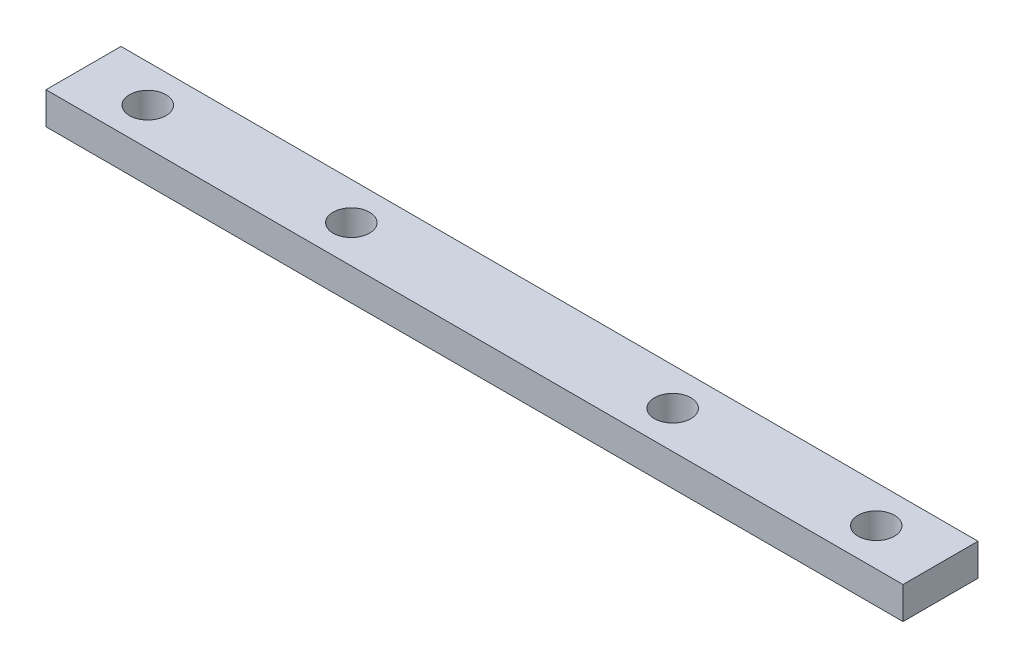
ISO-10303-21;
HEADER;
FILE_DESCRIPTION(('STEP AP214'),'2;1');
FILE_NAME('part.step','',(''),(''),'','','');
FILE_SCHEMA(('AUTOMOTIVE_DESIGN { 1 0 10303 214 1 1 1 1 }'));
ENDSEC;
DATA;
#1=APPLICATION_CONTEXT('core data for automotive mechanical design processes');
#2=APPLICATION_PROTOCOL_DEFINITION('international standard','automotive_design',2000,#1);
#3=PRODUCT_CONTEXT('',#1,'mechanical');
#4=PRODUCT('Part','Part','',(#3));
#5=PRODUCT_RELATED_PRODUCT_CATEGORY('part','',(#4));
#6=PRODUCT_DEFINITION_FORMATION('','',#4);
#7=PRODUCT_DEFINITION_CONTEXT('part definition',#1,'design');
#8=PRODUCT_DEFINITION('design','',#6,#7);
#9=PRODUCT_DEFINITION_SHAPE('','',#8);
#10=(LENGTH_UNIT() NAMED_UNIT(*) SI_UNIT(.MILLI.,.METRE.));
#11=(NAMED_UNIT(*) PLANE_ANGLE_UNIT() SI_UNIT($,.RADIAN.));
#12=(NAMED_UNIT(*) SI_UNIT($,.STERADIAN.) SOLID_ANGLE_UNIT());
#13=UNCERTAINTY_MEASURE_WITH_UNIT(LENGTH_MEASURE(1.E-05),#10,'distance_accuracy_value','');
#14=(GEOMETRIC_REPRESENTATION_CONTEXT(3) GLOBAL_UNCERTAINTY_ASSIGNED_CONTEXT((#13)) GLOBAL_UNIT_ASSIGNED_CONTEXT((#10,
#11,#12)) REPRESENTATION_CONTEXT('',''));
#15=CARTESIAN_POINT('',(0.,0.,0.));
#16=DIRECTION('',(0.,0.,1.));
#17=DIRECTION('',(1.,0.,0.));
#18=AXIS2_PLACEMENT_3D('',#15,#16,#17);
#19=CARTESIAN_POINT('',(40.,3.,3.5));
#20=DIRECTION('',(-1.,0.,0.));
#21=DIRECTION('',(0.,0.,1.));
#22=AXIS2_PLACEMENT_3D('',#19,#20,#21);
#23=PLANE('',#22);
#24=DIRECTION('',(0.,0.,-1.));
#25=VECTOR('',#24,1.);
#26=CARTESIAN_POINT('',(40.,0.,3.5));
#27=LINE('',#26,#25);
#28=CARTESIAN_POINT('',(40.,0.,3.5));
#29=VERTEX_POINT('',#28);
#30=CARTESIAN_POINT('',(40.,0.,-3.5));
#31=VERTEX_POINT('',#30);
#32=EDGE_CURVE('E96',#29,#31,#27,.T.);
#33=ORIENTED_EDGE('',*,*,#32,.T.);
#34=DIRECTION('',(0.,-1.,0.));
#35=VECTOR('',#34,1.);
#36=CARTESIAN_POINT('',(40.,3.,-3.5));
#37=LINE('',#36,#35);
#38=CARTESIAN_POINT('',(40.,3.,-3.5));
#39=VERTEX_POINT('',#38);
#40=EDGE_CURVE('E11',#39,#31,#37,.T.);
#41=ORIENTED_EDGE('',*,*,#40,.F.);
#42=DIRECTION('',(0.,0.,-1.));
#43=VECTOR('',#42,1.);
#44=CARTESIAN_POINT('',(40.,3.,3.5));
#45=LINE('',#44,#43);
#46=CARTESIAN_POINT('',(40.,3.,3.5));
#47=VERTEX_POINT('',#46);
#48=EDGE_CURVE('E84',#47,#39,#45,.T.);
#49=ORIENTED_EDGE('',*,*,#48,.F.);
#50=DIRECTION('',(0.,-1.,0.));
#51=VECTOR('',#50,1.);
#52=CARTESIAN_POINT('',(40.,3.,3.5));
#53=LINE('',#52,#51);
#54=EDGE_CURVE('E92',#47,#29,#53,.T.);
#55=ORIENTED_EDGE('',*,*,#54,.T.);
#56=EDGE_LOOP('',(#33,#41,#49,#55));
#57=FACE_BOUND('',#56,.T.);
#58=ADVANCED_FACE('F33',(#57),#23,.F.);
#59=CARTESIAN_POINT('',(-40.,3.,-3.5));
#60=DIRECTION('',(0.,0.,1.));
#61=DIRECTION('',(1.,0.,0.));
#62=AXIS2_PLACEMENT_3D('',#59,#60,#61);
#63=PLANE('',#62);
#64=DIRECTION('',(-1.,0.,0.));
#65=VECTOR('',#64,1.);
#66=CARTESIAN_POINT('',(-40.,0.,-3.5));
#67=LINE('',#66,#65);
#68=CARTESIAN_POINT('',(-40.,0.,-3.5));
#69=VERTEX_POINT('',#68);
#70=EDGE_CURVE('E88',#31,#69,#67,.T.);
#71=ORIENTED_EDGE('',*,*,#70,.T.);
#72=DIRECTION('',(0.,-1.,0.));
#73=VECTOR('',#72,1.);
#74=CARTESIAN_POINT('',(-40.,3.,-3.5));
#75=LINE('',#74,#73);
#76=CARTESIAN_POINT('',(-40.,3.,-3.5));
#77=VERTEX_POINT('',#76);
#78=EDGE_CURVE('E41',#77,#69,#75,.T.);
#79=ORIENTED_EDGE('',*,*,#78,.F.);
#80=DIRECTION('',(-1.,0.,0.));
#81=VECTOR('',#80,1.);
#82=CARTESIAN_POINT('',(-40.,3.,-3.5));
#83=LINE('',#82,#81);
#84=EDGE_CURVE('E79',#39,#77,#83,.T.);
#85=ORIENTED_EDGE('',*,*,#84,.F.);
#86=ORIENTED_EDGE('',*,*,#40,.T.);
#87=EDGE_LOOP('',(#71,#79,#85,#86));
#88=FACE_BOUND('',#87,.T.);
#89=ADVANCED_FACE('F87',(#88),#63,.F.);
#90=CARTESIAN_POINT('',(-40.,3.,3.5));
#91=DIRECTION('',(1.,0.,0.));
#92=DIRECTION('',(0.,0.,-1.));
#93=AXIS2_PLACEMENT_3D('',#90,#91,#92);
#94=PLANE('',#93);
#95=DIRECTION('',(0.,0.,1.));
#96=VECTOR('',#95,1.);
#97=CARTESIAN_POINT('',(-40.,0.,3.5));
#98=LINE('',#97,#96);
#99=CARTESIAN_POINT('',(-40.,0.,3.5));
#100=VERTEX_POINT('',#99);
#101=EDGE_CURVE('E66',#69,#100,#98,.T.);
#102=ORIENTED_EDGE('',*,*,#101,.T.);
#103=DIRECTION('',(0.,-1.,0.));
#104=VECTOR('',#103,1.);
#105=CARTESIAN_POINT('',(-40.,3.,3.5));
#106=LINE('',#105,#104);
#107=CARTESIAN_POINT('',(-40.,3.,3.5));
#108=VERTEX_POINT('',#107);
#109=EDGE_CURVE('E89',#108,#100,#106,.T.);
#110=ORIENTED_EDGE('',*,*,#109,.F.);
#111=DIRECTION('',(0.,0.,1.));
#112=VECTOR('',#111,1.);
#113=CARTESIAN_POINT('',(-40.,3.,3.5));
#114=LINE('',#113,#112);
#115=EDGE_CURVE('E82',#77,#108,#114,.T.);
#116=ORIENTED_EDGE('',*,*,#115,.F.);
#117=ORIENTED_EDGE('',*,*,#78,.T.);
#118=EDGE_LOOP('',(#102,#110,#116,#117));
#119=FACE_BOUND('',#118,.T.);
#120=ADVANCED_FACE('F90',(#119),#94,.F.);
#121=CARTESIAN_POINT('',(-40.,3.,3.5));
#122=DIRECTION('',(0.,0.,-1.));
#123=DIRECTION('',(-1.,0.,0.));
#124=AXIS2_PLACEMENT_3D('',#121,#122,#123);
#125=PLANE('',#124);
#126=DIRECTION('',(1.,0.,0.));
#127=VECTOR('',#126,1.);
#128=CARTESIAN_POINT('',(-40.,0.,3.5));
#129=LINE('',#128,#127);
#130=EDGE_CURVE('E72',#100,#29,#129,.T.);
#131=ORIENTED_EDGE('',*,*,#130,.T.);
#132=ORIENTED_EDGE('',*,*,#54,.F.);
#133=DIRECTION('',(1.,0.,0.));
#134=VECTOR('',#133,1.);
#135=CARTESIAN_POINT('',(-40.,3.,3.5));
#136=LINE('',#135,#134);
#137=EDGE_CURVE('E49',#108,#47,#136,.T.);
#138=ORIENTED_EDGE('',*,*,#137,.F.);
#139=ORIENTED_EDGE('',*,*,#109,.T.);
#140=EDGE_LOOP('',(#131,#132,#138,#139));
#141=FACE_BOUND('',#140,.T.);
#142=ADVANCED_FACE('F104',(#141),#125,.F.);
#143=CARTESIAN_POINT('',(0.,3.,0.));
#144=DIRECTION('',(0.,-1.,0.));
#145=DIRECTION('',(0.,0.,-1.));
#146=AXIS2_PLACEMENT_3D('',#143,#144,#145);
#147=PLANE('',#146);
#148=CARTESIAN_POINT('',(-15.,3.,0.));
#149=DIRECTION('',(0.,1.,0.));
#150=DIRECTION('',(0.,0.,1.));
#151=AXIS2_PLACEMENT_3D('',#148,#149,#150);
#152=CIRCLE('',#151,1.7);
#153=CARTESIAN_POINT('',(-15.,3.,1.7));
#154=VERTEX_POINT('',#153);
#155=EDGE_CURVE('E128',#154,#154,#152,.T.);
#156=ORIENTED_EDGE('',*,*,#155,.F.);
#157=EDGE_LOOP('',(#156));
#158=FACE_BOUND('',#157,.T.);
#159=CARTESIAN_POINT('',(15.,3.,0.));
#160=DIRECTION('',(0.,1.,0.));
#161=DIRECTION('',(0.,0.,1.));
#162=AXIS2_PLACEMENT_3D('',#159,#160,#161);
#163=CIRCLE('',#162,1.7);
#164=CARTESIAN_POINT('',(15.,3.,1.69999999999999));
#165=VERTEX_POINT('',#164);
#166=EDGE_CURVE('E122',#165,#165,#163,.T.);
#167=ORIENTED_EDGE('',*,*,#166,.F.);
#168=EDGE_LOOP('',(#167));
#169=FACE_BOUND('',#168,.T.);
#170=CARTESIAN_POINT('',(34.,3.,0.));
#171=DIRECTION('',(0.,1.,0.));
#172=DIRECTION('',(0.,0.,1.));
#173=AXIS2_PLACEMENT_3D('',#170,#171,#172);
#174=CIRCLE('',#173,1.7);
#175=CARTESIAN_POINT('',(34.,3.,1.69999999999999));
#176=VERTEX_POINT('',#175);
#177=EDGE_CURVE('E116',#176,#176,#174,.T.);
#178=ORIENTED_EDGE('',*,*,#177,.F.);
#179=EDGE_LOOP('',(#178));
#180=FACE_BOUND('',#179,.T.);
#181=CARTESIAN_POINT('',(-34.,3.,0.));
#182=DIRECTION('',(0.,1.,0.));
#183=DIRECTION('',(0.,0.,1.));
#184=AXIS2_PLACEMENT_3D('',#181,#182,#183);
#185=CIRCLE('',#184,1.7);
#186=CARTESIAN_POINT('',(-34.,3.,1.7));
#187=VERTEX_POINT('',#186);
#188=EDGE_CURVE('E110',#187,#187,#185,.T.);
#189=ORIENTED_EDGE('',*,*,#188,.F.);
#190=EDGE_LOOP('',(#189));
#191=FACE_BOUND('',#190,.T.);
#192=ORIENTED_EDGE('',*,*,#48,.T.);
#193=ORIENTED_EDGE('',*,*,#84,.T.);
#194=ORIENTED_EDGE('',*,*,#115,.T.);
#195=ORIENTED_EDGE('',*,*,#137,.T.);
#196=EDGE_LOOP('',(#192,#193,#194,#195));
#197=FACE_BOUND('',#196,.T.);
#198=ADVANCED_FACE('F80',(#158,#169,#180,#191,#197),#147,.F.);
#199=CARTESIAN_POINT('',(0.,0.,0.));
#200=DIRECTION('',(0.,-1.,0.));
#201=DIRECTION('',(0.,0.,-1.));
#202=AXIS2_PLACEMENT_3D('',#199,#200,#201);
#203=PLANE('',#202);
#204=CARTESIAN_POINT('',(-15.,0.,0.));
#205=DIRECTION('',(0.,1.,0.));
#206=DIRECTION('',(0.,0.,1.));
#207=AXIS2_PLACEMENT_3D('',#204,#205,#206);
#208=CIRCLE('',#207,1.7);
#209=CARTESIAN_POINT('',(-15.,0.,1.7));
#210=VERTEX_POINT('',#209);
#211=EDGE_CURVE('E113',#210,#210,#208,.T.);
#212=ORIENTED_EDGE('',*,*,#211,.T.);
#213=EDGE_LOOP('',(#212));
#214=FACE_BOUND('',#213,.T.);
#215=CARTESIAN_POINT('',(15.,0.,0.));
#216=DIRECTION('',(0.,1.,0.));
#217=DIRECTION('',(0.,0.,1.));
#218=AXIS2_PLACEMENT_3D('',#215,#216,#217);
#219=CIRCLE('',#218,1.7);
#220=CARTESIAN_POINT('',(15.,0.,1.69999999999999));
#221=VERTEX_POINT('',#220);
#222=EDGE_CURVE('E125',#221,#221,#219,.T.);
#223=ORIENTED_EDGE('',*,*,#222,.T.);
#224=EDGE_LOOP('',(#223));
#225=FACE_BOUND('',#224,.T.);
#226=CARTESIAN_POINT('',(34.,0.,0.));
#227=DIRECTION('',(0.,1.,0.));
#228=DIRECTION('',(0.,0.,1.));
#229=AXIS2_PLACEMENT_3D('',#226,#227,#228);
#230=CIRCLE('',#229,1.7);
#231=CARTESIAN_POINT('',(34.,0.,1.69999999999999));
#232=VERTEX_POINT('',#231);
#233=EDGE_CURVE('E119',#232,#232,#230,.T.);
#234=ORIENTED_EDGE('',*,*,#233,.T.);
#235=EDGE_LOOP('',(#234));
#236=FACE_BOUND('',#235,.T.);
#237=CARTESIAN_POINT('',(-34.,0.,0.));
#238=DIRECTION('',(0.,1.,0.));
#239=DIRECTION('',(0.,0.,1.));
#240=AXIS2_PLACEMENT_3D('',#237,#238,#239);
#241=CIRCLE('',#240,1.7);
#242=CARTESIAN_POINT('',(-34.,0.,1.7));
#243=VERTEX_POINT('',#242);
#244=EDGE_CURVE('E99',#243,#243,#241,.T.);
#245=ORIENTED_EDGE('',*,*,#244,.T.);
#246=EDGE_LOOP('',(#245));
#247=FACE_BOUND('',#246,.T.);
#248=ORIENTED_EDGE('',*,*,#32,.F.);
#249=ORIENTED_EDGE('',*,*,#130,.F.);
#250=ORIENTED_EDGE('',*,*,#101,.F.);
#251=ORIENTED_EDGE('',*,*,#70,.F.);
#252=EDGE_LOOP('',(#248,#249,#250,#251));
#253=FACE_BOUND('',#252,.T.);
#254=ADVANCED_FACE('F107',(#214,#225,#236,#247,#253),#203,.T.);
#255=CARTESIAN_POINT('',(-34.,0.,0.));
#256=DIRECTION('',(0.,1.,0.));
#257=DIRECTION('',(0.,0.,1.));
#258=AXIS2_PLACEMENT_3D('',#255,#256,#257);
#259=CYLINDRICAL_SURFACE('',#258,1.7);
#260=ORIENTED_EDGE('',*,*,#244,.F.);
#261=EDGE_LOOP('',(#260));
#262=FACE_BOUND('',#261,.T.);
#263=ORIENTED_EDGE('',*,*,#188,.T.);
#264=EDGE_LOOP('',(#263));
#265=FACE_BOUND('',#264,.T.);
#266=ADVANCED_FACE('F152',(#262,#265),#259,.F.);
#267=CARTESIAN_POINT('',(34.,0.,0.));
#268=DIRECTION('',(0.,1.,0.));
#269=DIRECTION('',(0.,0.,1.));
#270=AXIS2_PLACEMENT_3D('',#267,#268,#269);
#271=CYLINDRICAL_SURFACE('',#270,1.7);
#272=ORIENTED_EDGE('',*,*,#233,.F.);
#273=EDGE_LOOP('',(#272));
#274=FACE_BOUND('',#273,.T.);
#275=ORIENTED_EDGE('',*,*,#177,.T.);
#276=EDGE_LOOP('',(#275));
#277=FACE_BOUND('',#276,.T.);
#278=ADVANCED_FACE('F154',(#274,#277),#271,.F.);
#279=CARTESIAN_POINT('',(15.,0.,0.));
#280=DIRECTION('',(0.,1.,0.));
#281=DIRECTION('',(0.,0.,1.));
#282=AXIS2_PLACEMENT_3D('',#279,#280,#281);
#283=CYLINDRICAL_SURFACE('',#282,1.7);
#284=ORIENTED_EDGE('',*,*,#222,.F.);
#285=EDGE_LOOP('',(#284));
#286=FACE_BOUND('',#285,.T.);
#287=ORIENTED_EDGE('',*,*,#166,.T.);
#288=EDGE_LOOP('',(#287));
#289=FACE_BOUND('',#288,.T.);
#290=ADVANCED_FACE('F139',(#286,#289),#283,.F.);
#291=CARTESIAN_POINT('',(-15.,0.,0.));
#292=DIRECTION('',(0.,1.,0.));
#293=DIRECTION('',(0.,0.,1.));
#294=AXIS2_PLACEMENT_3D('',#291,#292,#293);
#295=CYLINDRICAL_SURFACE('',#294,1.7);
#296=ORIENTED_EDGE('',*,*,#211,.F.);
#297=EDGE_LOOP('',(#296));
#298=FACE_BOUND('',#297,.T.);
#299=ORIENTED_EDGE('',*,*,#155,.T.);
#300=EDGE_LOOP('',(#299));
#301=FACE_BOUND('',#300,.T.);
#302=ADVANCED_FACE('F136',(#298,#301),#295,.F.);
#303=CLOSED_SHELL('',(#58,#89,#120,#142,#198,#254,#266,#278,#290,#302));
#304=MANIFOLD_SOLID_BREP('B2',#303);
#305=ADVANCED_BREP_SHAPE_REPRESENTATION('',(#18,#304),#14);
#306=SHAPE_DEFINITION_REPRESENTATION(#9,#305);
ENDSEC;
END-ISO-10303-21;
